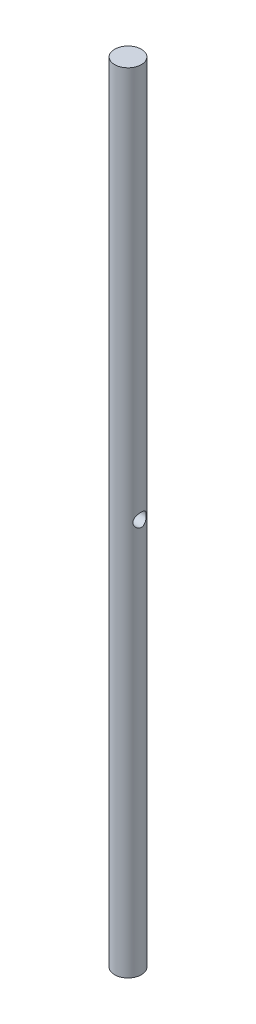
ISO-10303-21;
HEADER;
FILE_DESCRIPTION(('STEP AP214'),'2;1');
FILE_NAME('part.step','',(''),(''),'','','');
FILE_SCHEMA(('AUTOMOTIVE_DESIGN { 1 0 10303 214 1 1 1 1 }'));
ENDSEC;
DATA;
#1=APPLICATION_CONTEXT('core data for automotive mechanical design processes');
#2=APPLICATION_PROTOCOL_DEFINITION('international standard','automotive_design',2000,#1);
#3=PRODUCT_CONTEXT('',#1,'mechanical');
#4=PRODUCT('Part','Part','',(#3));
#5=PRODUCT_RELATED_PRODUCT_CATEGORY('part','',(#4));
#6=PRODUCT_DEFINITION_FORMATION('','',#4);
#7=PRODUCT_DEFINITION_CONTEXT('part definition',#1,'design');
#8=PRODUCT_DEFINITION('design','',#6,#7);
#9=PRODUCT_DEFINITION_SHAPE('','',#8);
#10=(LENGTH_UNIT() NAMED_UNIT(*) SI_UNIT(.MILLI.,.METRE.));
#11=(NAMED_UNIT(*) PLANE_ANGLE_UNIT() SI_UNIT($,.RADIAN.));
#12=(NAMED_UNIT(*) SI_UNIT($,.STERADIAN.) SOLID_ANGLE_UNIT());
#13=UNCERTAINTY_MEASURE_WITH_UNIT(LENGTH_MEASURE(1.E-05),#10,'distance_accuracy_value','');
#14=(GEOMETRIC_REPRESENTATION_CONTEXT(3) GLOBAL_UNCERTAINTY_ASSIGNED_CONTEXT((#13)) GLOBAL_UNIT_ASSIGNED_CONTEXT((#10,
#11,#12)) REPRESENTATION_CONTEXT('',''));
#15=CARTESIAN_POINT('',(0.,0.,0.));
#16=DIRECTION('',(0.,0.,1.));
#17=DIRECTION('',(1.,0.,0.));
#18=AXIS2_PLACEMENT_3D('',#15,#16,#17);
#19=CARTESIAN_POINT('',(0.,59.,0.));
#20=DIRECTION('',(0.,-1.,0.));
#21=DIRECTION('',(0.,0.,-1.));
#22=AXIS2_PLACEMENT_3D('',#19,#20,#21);
#23=CYLINDRICAL_SURFACE('',#22,1.);
#24=CARTESIAN_POINT('',(-1.,29.,0.));
#25=CARTESIAN_POINT('',(-0.999998567020754,29.0000016511597,-0.0262859814764931));
#26=CARTESIAN_POINT('',(-0.998952455097588,29.0020850365608,-0.0526032998490162));
#27=CARTESIAN_POINT('',(-0.994870780186981,29.0103264401705,-0.104460117634213));
#28=CARTESIAN_POINT('',(-0.991831439144918,29.0164921964988,-0.129998043356752));
#29=CARTESIAN_POINT('',(-0.984081397016558,29.0325969043084,-0.179466772440287));
#30=CARTESIAN_POINT('',(-0.979377195887601,29.042521192124,-0.20340340146959));
#31=CARTESIAN_POINT('',(-0.968728882578893,29.0657853106825,-0.249236308403283));
#32=CARTESIAN_POINT('',(-0.962784868167649,29.0791248721244,-0.271132746995026));
#33=CARTESIAN_POINT('',(-0.949781291290284,29.1097586247426,-0.313753908880961));
#34=CARTESIAN_POINT('',(-0.942675995637679,29.1272432396198,-0.334327605561057));
#35=CARTESIAN_POINT('',(-0.928299851233721,29.1652607396235,-0.37238972243349));
#36=CARTESIAN_POINT('',(-0.921028881045174,29.1857959258862,-0.389875791553385));
#37=CARTESIAN_POINT('',(-0.906494755986735,29.2312416747617,-0.422626000225141));
#38=CARTESIAN_POINT('',(-0.899275934850658,29.256368049173,-0.43761266777582));
#39=CARTESIAN_POINT('',(-0.886429893861603,29.3091836679931,-0.463084113445348));
#40=CARTESIAN_POINT('',(-0.880801538034948,29.3368710643614,-0.473572107483167));
#41=CARTESIAN_POINT('',(-0.872289335189043,29.392332552711,-0.489066221094294));
#42=CARTESIAN_POINT('',(-0.869261357918568,29.4200022260337,-0.494362928540221));
#43=CARTESIAN_POINT('',(-0.865909449742638,29.4759894188897,-0.500213496654424));
#44=CARTESIAN_POINT('',(-0.86558284671644,29.5043062704356,-0.500772044186538));
#45=CARTESIAN_POINT('',(-0.867554651286242,29.5571430121577,-0.497343643586148));
#46=CARTESIAN_POINT('',(-0.869543818310067,29.5817120156115,-0.493892279768412));
#47=CARTESIAN_POINT('',(-0.875381143669251,29.6298609546865,-0.483469924528467));
#48=CARTESIAN_POINT('',(-0.879229894158881,29.6534405726527,-0.476497811948827));
#49=CARTESIAN_POINT('',(-0.888437382063705,29.6996145662828,-0.459104890193003));
#50=CARTESIAN_POINT('',(-0.893829203319992,29.7221731993929,-0.448607533557998));
#51=CARTESIAN_POINT('',(-0.905517021407018,29.765317146295,-0.424520843834002));
#52=CARTESIAN_POINT('',(-0.911813423900953,29.7859015678,-0.410930121906234));
#53=CARTESIAN_POINT('',(-0.925565789516429,29.8272606263716,-0.379033027456395));
#54=CARTESIAN_POINT('',(-0.93306755118373,29.8477284367881,-0.360347229184642));
#55=CARTESIAN_POINT('',(-0.947738116502036,29.8853677092954,-0.319777789370688));
#56=CARTESIAN_POINT('',(-0.954906759794004,29.9025375960169,-0.297892628287144));
#57=CARTESIAN_POINT('',(-0.968509936414819,29.9338428305149,-0.250258252915925));
#58=CARTESIAN_POINT('',(-0.974894920810037,29.9478002362229,-0.224376795799705));
#59=CARTESIAN_POINT('',(-0.985789405606211,29.9710485145215,-0.170233107744398));
#60=CARTESIAN_POINT('',(-0.990300394717763,29.9803430925076,-0.141972788132637));
#61=CARTESIAN_POINT('',(-0.99662166870718,29.9932377018583,-0.0863832458303493));
#62=CARTESIAN_POINT('',(-0.998624691506558,29.9972456178734,-0.0591707652741609));
#63=CARTESIAN_POINT('',(-1.00036506729551,30.0007323655672,-0.00438979997467622));
#64=CARTESIAN_POINT('',(-1.00010349360656,30.0002133428197,0.023178509934951));
#65=CARTESIAN_POINT('',(-0.997455961267204,29.9948966557906,0.0756164859929968));
#66=CARTESIAN_POINT('',(-0.995236228440948,29.990433733635,0.100529704024977));
#67=CARTESIAN_POINT('',(-0.989110856574095,29.9778809640525,0.149203446150959));
#68=CARTESIAN_POINT('',(-0.985205031671662,29.9697907167733,0.172963842845499));
#69=CARTESIAN_POINT('',(-0.975921257068347,29.9500007667834,0.219444304224833));
#70=CARTESIAN_POINT('',(-0.970504408849696,29.9382044749416,0.242115198503077));
#71=CARTESIAN_POINT('',(-0.958719871585545,29.911446232177,0.285230680849461));
#72=CARTESIAN_POINT('',(-0.952351777828926,29.8964829327033,0.305674314887641));
#73=CARTESIAN_POINT('',(-0.938541106687322,29.8621197873336,0.345883844645326));
#74=CARTESIAN_POINT('',(-0.931054424242207,29.8424285657732,0.365386038912318));
#75=CARTESIAN_POINT('',(-0.916311958019372,29.8000374243653,0.400928160556618));
#76=CARTESIAN_POINT('',(-0.909056336907631,29.7773354405918,0.416965692845421));
#77=CARTESIAN_POINT('',(-0.895255961130339,29.7281781728998,0.44585395724885));
#78=CARTESIAN_POINT('',(-0.888762648317359,29.7015943668957,0.45851274793932));
#79=CARTESIAN_POINT('',(-0.87787036184063,29.6462449661537,0.479041413006903));
#80=CARTESIAN_POINT('',(-0.873468691203089,29.6174822367494,0.486917457943786));
#81=CARTESIAN_POINT('',(-0.867807505043333,29.5615448885693,0.49693084372484));
#82=CARTESIAN_POINT('',(-0.866286917302456,29.5344828732855,0.499546498200433));
#83=CARTESIAN_POINT('',(-0.865826773230875,29.4802764664146,0.500344577190394));
#84=CARTESIAN_POINT('',(-0.866886098137763,29.4531321156303,0.4985289233122));
#85=CARTESIAN_POINT('',(-0.871189310250123,29.402258249234,0.490963062796132));
#86=CARTESIAN_POINT('',(-0.874215472411968,29.3784497649278,0.485604157171399));
#87=CARTESIAN_POINT('',(-0.881855080939588,29.3320959402876,0.471587679112322));
#88=CARTESIAN_POINT('',(-0.886469037848378,29.309551008954,0.462929045579906));
#89=CARTESIAN_POINT('',(-0.89714265182264,29.2646875745067,0.441907872650342));
#90=CARTESIAN_POINT('',(-0.903278611980953,29.2424860490851,0.429335568908229));
#91=CARTESIAN_POINT('',(-0.916176658172951,29.2003627319097,0.401075485818316));
#92=CARTESIAN_POINT('',(-0.922939068972611,29.1804421347408,0.385386085619323));
#93=CARTESIAN_POINT('',(-0.937311615796565,29.1409290088212,0.34910166333232));
#94=CARTESIAN_POINT('',(-0.944924916557343,29.121670448819,0.328142211505086));
#95=CARTESIAN_POINT('',(-0.959388761275438,29.0868685082882,0.283077403110141));
#96=CARTESIAN_POINT('',(-0.966238893040199,29.0713271302869,0.258970361628394));
#97=CARTESIAN_POINT('',(-0.978490047925515,29.0443818186189,0.207965798409975));
#98=CARTESIAN_POINT('',(-0.983880482814544,29.0330079152943,0.181049751967308));
#99=CARTESIAN_POINT('',(-0.992506706817327,29.0150959160405,0.125371050647096));
#100=CARTESIAN_POINT('',(-0.99574861686466,29.0085440765852,0.0966138998115831));
#101=CARTESIAN_POINT('',(-0.998477309548316,29.0030512944621,0.0563009732416914));
#102=CARTESIAN_POINT('',(-0.999046826696008,29.0019086795682,0.045080939719749));
#103=CARTESIAN_POINT('',(-0.999808484889324,29.0003826672416,0.0225758659035787));
#104=CARTESIAN_POINT('',(-1.00000061551882,28.9999992907644,0.0112908238236906));
#105=CARTESIAN_POINT('',(-1.,29.,0.));
#106=B_SPLINE_CURVE_WITH_KNOTS('',3,(#24,#25,#26,#27,#28,#29,#30,#31,#32,#33,#34,#35,#36,#37,
#38,#39,#40,#41,#42,#43,#44,#45,#46,#47,#48,#49,#50,#51,#52,#53,#54,#55,#56,#57,#58,#59,#60,#61,
#62,#63,#64,#65,#66,#67,#68,#69,#70,#71,#72,#73,#74,#75,#76,#77,#78,#79,#80,#81,#82,#83,#84,#85,
#86,#87,#88,#89,#90,#91,#92,#93,#94,#95,#96,#97,#98,#99,#100,#101,#102,#103,#104,#105),
.UNSPECIFIED.,.T.,.F.,(4,2,2,2,2,2,2,2,2,2,2,2,2,2,2,2,2,2,2,2,2,2,2,2,2,2,2,2,2,2,2,2,2,2,2,2,
2,2,2,2,4),(0.,0.078812128710146,0.1577740748546,0.236431077746149,0.315081880290786,
0.398490879359048,0.481963118827018,0.571908632153764,0.661789739491406,0.746290060701146,
0.830706786645102,0.905028562046605,0.979374019628394,1.05545120084244,1.13156260630111,
1.21732470666939,1.30312767299343,1.39291511107221,1.4826310845614,1.56491645235673,
1.64716282255738,1.72303453253061,1.79891460815466,1.8769642801395,1.9550472537417,
2.04079805322209,2.12660794307716,2.21657341079838,2.30642255970389,2.38764653749187,
2.46883529930003,2.54228965122092,2.6157676439184,2.69418228387808,2.77263780569479,
2.86062621376249,2.94866191688287,3.03732006831463,3.12572454312466,3.15957640068849,
3.19342919257424),.UNSPECIFIED.);
#107=CARTESIAN_POINT('',(-1.,29.,0.));
#108=VERTEX_POINT('',#107);
#109=EDGE_CURVE('E10',#108,#108,#106,.T.);
#110=ORIENTED_EDGE('',*,*,#109,.T.);
#111=EDGE_LOOP('',(#110));
#112=FACE_BOUND('',#111,.T.);
#113=CARTESIAN_POINT('',(0.866025403784438,29.5,-0.500000000000001));
#114=CARTESIAN_POINT('',(0.866027673641386,29.4739460959025,-0.499998181537064));
#115=CARTESIAN_POINT('',(0.867219005938538,29.4478592942375,-0.497949985366555));
#116=CARTESIAN_POINT('',(0.871811832260506,29.3964863676614,-0.489861604949082));
#117=CARTESIAN_POINT('',(0.875217970277862,29.3712020424783,-0.483813032277105));
#118=CARTESIAN_POINT('',(0.883746733026927,29.322274167828,-0.468049974349892));
#119=CARTESIAN_POINT('',(0.888860217366242,29.2986226737632,-0.458354976246862));
#120=CARTESIAN_POINT('',(0.900213324084306,29.2532878990016,-0.435633762688191));
#121=CARTESIAN_POINT('',(0.906453007380327,29.2316047248688,-0.422607367017888));
#122=CARTESIAN_POINT('',(0.919984345287201,29.1888471357212,-0.392333270265439));
#123=CARTESIAN_POINT('',(0.927320318189766,29.1679704321632,-0.374826018071886));
#124=CARTESIAN_POINT('',(0.941859913928529,29.1292958057966,-0.336626903807236));
#125=CARTESIAN_POINT('',(0.94906346915625,29.1114994187082,-0.315933462891148));
#126=CARTESIAN_POINT('',(0.963107384764744,29.0783164244262,-0.270244781707274));
#127=CARTESIAN_POINT('',(0.969890532090862,29.0631731160702,-0.245053594506288));
#128=CARTESIAN_POINT('',(0.981753780497645,29.0374295733771,-0.192078513299752));
#129=CARTESIAN_POINT('',(0.986834955918708,29.0268264719314,-0.164296269069078));
#130=CARTESIAN_POINT('',(0.994402306221187,29.0112476693495,-0.109022471962989));
#131=CARTESIAN_POINT('',(0.99704740110446,29.0059252368222,-0.0816508952444089));
#132=CARTESIAN_POINT('',(1.00003791923034,28.9999169406625,-0.0262853143489245));
#133=CARTESIAN_POINT('',(1.00038473392295,28.9992282716021,0.0017083029218686));
#134=CARTESIAN_POINT('',(0.998814909582251,29.0023733369852,0.0549162622118745));
#135=CARTESIAN_POINT('',(0.997092479460802,29.0058190077606,0.0801605995883955));
#136=CARTESIAN_POINT('',(0.991871226298737,29.0164404219523,0.129656885959161));
#137=CARTESIAN_POINT('',(0.988372270331969,29.0236164444881,0.153908760546963));
#138=CARTESIAN_POINT('',(0.979857916438272,29.0415412830449,0.201154695784776));
#139=CARTESIAN_POINT('',(0.974822207645996,29.052338156586,0.224126711757587));
#140=CARTESIAN_POINT('',(0.963688229933436,29.0771317081007,0.267988400756662));
#141=CARTESIAN_POINT('',(0.957589580787421,29.0911295316512,0.288877324419322));
#142=CARTESIAN_POINT('',(0.944221971996146,29.1234476757665,0.330086830449097));
#143=CARTESIAN_POINT('',(0.936896879990876,29.142051514163,0.35016703751468));
#144=CARTESIAN_POINT('',(0.922271702934058,29.1822948624651,0.387052185148889));
#145=CARTESIAN_POINT('',(0.914971641328144,29.203936686137,0.403854605787115));
#146=CARTESIAN_POINT('',(0.900720780462423,29.251324096212,0.434752667321105));
#147=CARTESIAN_POINT('',(0.893821599953537,29.2772430115271,0.448608657489026));
#148=CARTESIAN_POINT('',(0.881877251392879,29.3314688356795,0.471659556500617));
#149=CARTESIAN_POINT('',(0.876830150230337,29.3597732165088,0.480859329105445));
#150=CARTESIAN_POINT('',(0.869723179085172,29.4156072556414,0.49359010551252));
#151=CARTESIAN_POINT('',(0.867458279242482,29.4430205595218,0.497512561059988));
#152=CARTESIAN_POINT('',(0.865589596808047,29.4982006707583,0.500758473305714));
#153=CARTESIAN_POINT('',(0.865983934446557,29.5259672145599,0.500085178657514));
#154=CARTESIAN_POINT('',(0.869171682702924,29.5778269592894,0.494518021671984));
#155=CARTESIAN_POINT('',(0.87169793753327,29.601989725554,0.490093908356235));
#156=CARTESIAN_POINT('',(0.878470107756705,29.6491838931355,0.477848142316222));
#157=CARTESIAN_POINT('',(0.882716580025168,29.6722149253733,0.470025389311808));
#158=CARTESIAN_POINT('',(0.892681110398283,29.7177056654513,0.450823794302444));
#159=CARTESIAN_POINT('',(0.898458216215316,29.7400895084268,0.439297031846362));
#160=CARTESIAN_POINT('',(0.910780597486248,29.7827346357695,0.413143532007902));
#161=CARTESIAN_POINT('',(0.917326266775738,29.8029948217566,0.398515202166108));
#162=CARTESIAN_POINT('',(0.931439992281681,29.8434893837618,0.364418583599426));
#163=CARTESIAN_POINT('',(0.939032915771447,29.8633985753588,0.344572636157482));
#164=CARTESIAN_POINT('',(0.953671174889461,29.8997061189968,0.301702247699144));
#165=CARTESIAN_POINT('',(0.96071632503854,29.9161032851153,0.278676737327674));
#166=CARTESIAN_POINT('',(0.973706808454791,29.945286862975,0.229267681279377));
#167=CARTESIAN_POINT('',(0.979618208360172,29.9579665591055,0.202811548787051));
#168=CARTESIAN_POINT('',(0.989416774796479,29.9785689519287,0.147761182320548));
#169=CARTESIAN_POINT('',(0.993305718381767,29.9864958256832,0.119168850696111));
#170=CARTESIAN_POINT('',(0.998337540909502,29.9966842820873,0.0634898411651896));
#171=CARTESIAN_POINT('',(0.999699639541274,29.999398937938,0.0365057219251583));
#172=CARTESIAN_POINT('',(1.00021065187534,30.0004216327273,-0.0175629929755289));
#173=CARTESIAN_POINT('',(0.999360340333266,29.998731214262,-0.0446475501472762));
#174=CARTESIAN_POINT('',(0.995669844190719,29.991291796602,-0.09626899615882));
#175=CARTESIAN_POINT('',(0.992964473343949,29.9858175753705,-0.120856158906528));
#176=CARTESIAN_POINT('',(0.985960468313117,29.9713365003491,-0.168722976090911));
#177=CARTESIAN_POINT('',(0.981661605649085,29.9623291399556,-0.192002442474413));
#178=CARTESIAN_POINT('',(0.97162965375613,29.9406364739146,-0.237711703125925));
#179=CARTESIAN_POINT('',(0.965843086053095,29.9278103383869,-0.260062571363278));
#180=CARTESIAN_POINT('',(0.953440665650003,29.8990210345797,-0.302387320893749));
#181=CARTESIAN_POINT('',(0.946824432570785,29.8830564254766,-0.322360103657878));
#182=CARTESIAN_POINT('',(0.932643051375993,29.8466014304504,-0.361457002133394));
#183=CARTESIAN_POINT('',(0.925048996007109,29.8258187561126,-0.380298842483295));
#184=CARTESIAN_POINT('',(0.910315381771854,29.7812746392844,-0.414331643912887));
#185=CARTESIAN_POINT('',(0.903176229068854,29.7575105895245,-0.429519375063787));
#186=CARTESIAN_POINT('',(0.889998026256437,29.7066816767509,-0.456215539833051));
#187=CARTESIAN_POINT('',(0.884000871211844,29.6795362344463,-0.467592532964975));
#188=CARTESIAN_POINT('',(0.87433078171103,29.6233337978194,-0.485439354768649));
#189=CARTESIAN_POINT('',(0.870650080748793,29.5942835555421,-0.491925595589966));
#190=CARTESIAN_POINT('',(0.867646363005208,29.5540973221746,-0.497183503931373));
#191=CARTESIAN_POINT('',(0.867040645024727,29.5433160528012,-0.498238052481696));
#192=CARTESIAN_POINT('',(0.866229679439781,29.5216917596587,-0.499646702545212));
#193=CARTESIAN_POINT('',(0.866024458625925,29.510848731807,-0.500000757200021));
#194=CARTESIAN_POINT('',(0.866025403784438,29.5,-0.500000000000001));
#195=B_SPLINE_CURVE_WITH_KNOTS('',3,(#113,#114,#115,#116,#117,#118,#119,#120,#121,#122,#123,
#124,#125,#126,#127,#128,#129,#130,#131,#132,#133,#134,#135,#136,#137,#138,#139,#140,#141,#142,
#143,#144,#145,#146,#147,#148,#149,#150,#151,#152,#153,#154,#155,#156,#157,#158,#159,#160,#161,
#162,#163,#164,#165,#166,#167,#168,#169,#170,#171,#172,#173,#174,#175,#176,#177,#178,#179,#180,
#181,#182,#183,#184,#185,#186,#187,#188,#189,#190,#191,#192,#193,#194),.UNSPECIFIED.,.T.,.F.,(4,
2,2,2,2,2,2,2,2,2,2,2,2,2,2,2,2,2,2,2,2,2,2,2,2,2,2,2,2,2,2,2,2,2,2,2,2,2,2,2,4),(0.,
0.0781160612973583,0.156396446412402,0.234264297959445,0.312136362722574,0.396431156249117,
0.480767855421856,0.570789461193818,0.660754134819456,0.744317424839676,0.8278301184302,
0.904080487422692,0.980336562587276,1.05764767365573,1.13498649675136,1.21963595728445,
1.30435024122959,1.39444420864724,1.48444387105853,1.56731145427106,1.65012046594186,
1.72387091712013,1.79764526218032,1.87483648203044,1.95206743110024,2.03903371790307,
2.12602932489101,2.21532090706483,2.30453389904386,2.38556135194744,2.46656043396986,
2.54222212435746,2.61789466756007,2.69680375359736,2.7757491505036,2.8625512092522,
2.94942971422226,3.03905374518951,3.12837566501029,3.16090067592303,3.19342786246919),.UNSPECIFIED.);
#196=CARTESIAN_POINT('',(0.866025403784438,29.5,-0.500000000000001));
#197=VERTEX_POINT('',#196);
#198=EDGE_CURVE('E49',#197,#197,#195,.T.);
#199=ORIENTED_EDGE('',*,*,#198,.T.);
#200=EDGE_LOOP('',(#199));
#201=FACE_BOUND('',#200,.T.);
#202=CARTESIAN_POINT('',(0.,59.,0.));
#203=DIRECTION('',(0.,1.,0.));
#204=DIRECTION('',(0.,0.,1.));
#205=AXIS2_PLACEMENT_3D('',#202,#203,#204);
#206=CIRCLE('',#205,1.);
#207=CARTESIAN_POINT('',(0.,59.,1.));
#208=VERTEX_POINT('',#207);
#209=EDGE_CURVE('E54',#208,#208,#206,.T.);
#210=ORIENTED_EDGE('',*,*,#209,.F.);
#211=EDGE_LOOP('',(#210));
#212=FACE_BOUND('',#211,.T.);
#213=CARTESIAN_POINT('',(0.,0.,0.));
#214=DIRECTION('',(0.,1.,0.));
#215=DIRECTION('',(0.,0.,1.));
#216=AXIS2_PLACEMENT_3D('',#213,#214,#215);
#217=CIRCLE('',#216,1.);
#218=CARTESIAN_POINT('',(0.,0.,1.));
#219=VERTEX_POINT('',#218);
#220=EDGE_CURVE('E59',#219,#219,#217,.T.);
#221=ORIENTED_EDGE('',*,*,#220,.T.);
#222=EDGE_LOOP('',(#221));
#223=FACE_BOUND('',#222,.T.);
#224=ADVANCED_FACE('F37',(#112,#201,#212,#223),#23,.T.);
#225=CARTESIAN_POINT('',(0.,59.,0.));
#226=DIRECTION('',(0.,1.,0.));
#227=DIRECTION('',(0.,0.,1.));
#228=AXIS2_PLACEMENT_3D('',#225,#226,#227);
#229=PLANE('',#228);
#230=ORIENTED_EDGE('',*,*,#209,.T.);
#231=EDGE_LOOP('',(#230));
#232=FACE_BOUND('',#231,.T.);
#233=ADVANCED_FACE('F71',(#232),#229,.T.);
#234=CARTESIAN_POINT('',(0.,0.,0.));
#235=DIRECTION('',(0.,1.,0.));
#236=DIRECTION('',(0.,0.,1.));
#237=AXIS2_PLACEMENT_3D('',#234,#235,#236);
#238=PLANE('',#237);
#239=ORIENTED_EDGE('',*,*,#220,.F.);
#240=EDGE_LOOP('',(#239));
#241=FACE_BOUND('',#240,.T.);
#242=ADVANCED_FACE('F69',(#241),#238,.F.);
#243=CARTESIAN_POINT('',(-1.,29.5,0.));
#244=DIRECTION('',(1.,0.,0.));
#245=DIRECTION('',(0.,0.,-1.));
#246=AXIS2_PLACEMENT_3D('',#243,#244,#245);
#247=CYLINDRICAL_SURFACE('',#246,0.500000000000001);
#248=ORIENTED_EDGE('',*,*,#198,.F.);
#249=EDGE_LOOP('',(#248));
#250=FACE_BOUND('',#249,.T.);
#251=ORIENTED_EDGE('',*,*,#109,.F.);
#252=EDGE_LOOP('',(#251));
#253=FACE_BOUND('',#252,.T.);
#254=ADVANCED_FACE('F65',(#250,#253),#247,.F.);
#255=CLOSED_SHELL('',(#224,#233,#242,#254));
#256=MANIFOLD_SOLID_BREP('B2',#255);
#257=ADVANCED_BREP_SHAPE_REPRESENTATION('',(#18,#256),#14);
#258=SHAPE_DEFINITION_REPRESENTATION(#9,#257);
ENDSEC;
END-ISO-10303-21;
